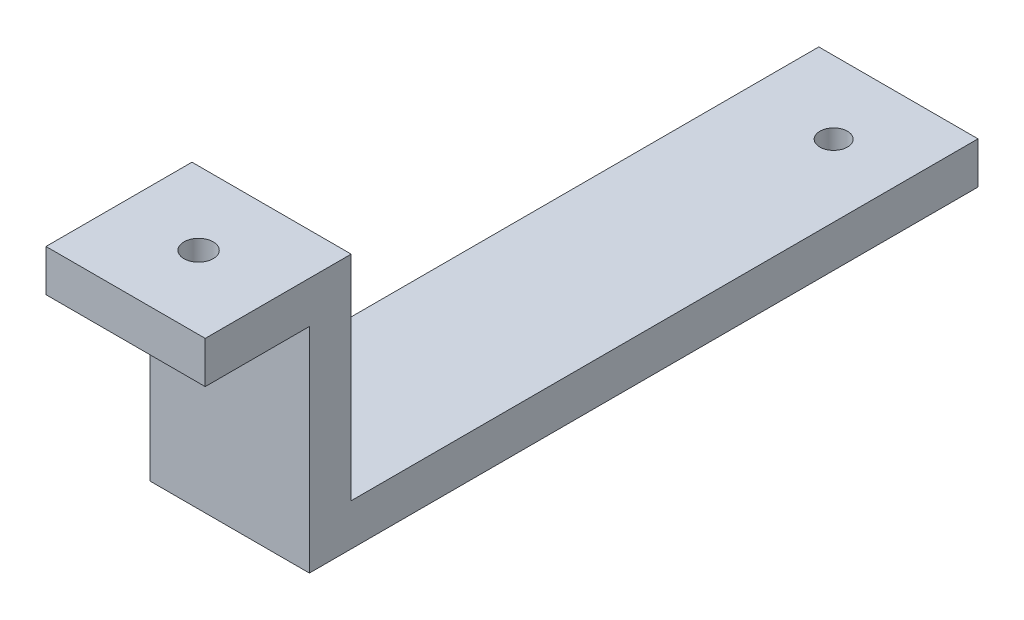
ISO-10303-21;
HEADER;
FILE_DESCRIPTION(('STEP AP214'),'2;1');
FILE_NAME('part.step','',(''),(''),'','','');
FILE_SCHEMA(('AUTOMOTIVE_DESIGN { 1 0 10303 214 1 1 1 1 }'));
ENDSEC;
DATA;
#1=APPLICATION_CONTEXT('core data for automotive mechanical design processes');
#2=APPLICATION_PROTOCOL_DEFINITION('international standard','automotive_design',2000,#1);
#3=PRODUCT_CONTEXT('',#1,'mechanical');
#4=PRODUCT('Part','Part','',(#3));
#5=PRODUCT_RELATED_PRODUCT_CATEGORY('part','',(#4));
#6=PRODUCT_DEFINITION_FORMATION('','',#4);
#7=PRODUCT_DEFINITION_CONTEXT('part definition',#1,'design');
#8=PRODUCT_DEFINITION('design','',#6,#7);
#9=PRODUCT_DEFINITION_SHAPE('','',#8);
#10=(LENGTH_UNIT() NAMED_UNIT(*) SI_UNIT(.MILLI.,.METRE.));
#11=(NAMED_UNIT(*) PLANE_ANGLE_UNIT() SI_UNIT($,.RADIAN.));
#12=(NAMED_UNIT(*) SI_UNIT($,.STERADIAN.) SOLID_ANGLE_UNIT());
#13=UNCERTAINTY_MEASURE_WITH_UNIT(LENGTH_MEASURE(1.E-05),#10,'distance_accuracy_value','');
#14=(GEOMETRIC_REPRESENTATION_CONTEXT(3) GLOBAL_UNCERTAINTY_ASSIGNED_CONTEXT((#13)) GLOBAL_UNIT_ASSIGNED_CONTEXT((#10,
#11,#12)) REPRESENTATION_CONTEXT('',''));
#15=CARTESIAN_POINT('',(0.,0.,0.));
#16=DIRECTION('',(0.,0.,1.));
#17=DIRECTION('',(1.,0.,0.));
#18=AXIS2_PLACEMENT_3D('',#15,#16,#17);
#19=CARTESIAN_POINT('',(38.1,-61.11,-34.93));
#20=DIRECTION('',(0.,1.,0.));
#21=DIRECTION('',(0.,0.,1.));
#22=AXIS2_PLACEMENT_3D('',#19,#20,#21);
#23=PLANE('',#22);
#24=CARTESIAN_POINT('',(20.8975904207719,-61.11,-167.593539999984));
#25=DIRECTION('',(0.,1.,0.));
#26=DIRECTION('',(0.,0.,1.));
#27=AXIS2_PLACEMENT_3D('',#24,#25,#26);
#28=CIRCLE('',#27,3.3);
#29=CARTESIAN_POINT('',(20.8975904207719,-61.11,-164.293539999984));
#30=VERTEX_POINT('',#29);
#31=EDGE_CURVE('E183',#30,#30,#28,.T.);
#32=ORIENTED_EDGE('',*,*,#31,.T.);
#33=EDGE_LOOP('',(#32));
#34=FACE_BOUND('',#33,.T.);
#35=DIRECTION('',(0.,0.,-1.));
#36=VECTOR('',#35,1.);
#37=CARTESIAN_POINT('',(0.,-61.11,-34.93));
#38=LINE('',#37,#36);
#39=CARTESIAN_POINT('',(0.,-61.11,-24.93));
#40=VERTEX_POINT('',#39);
#41=CARTESIAN_POINT('',(0.,-61.11,-184.93));
#42=VERTEX_POINT('',#41);
#43=EDGE_CURVE('E132',#40,#42,#38,.T.);
#44=ORIENTED_EDGE('',*,*,#43,.T.);
#45=DIRECTION('',(-1.,0.,0.));
#46=VECTOR('',#45,1.);
#47=CARTESIAN_POINT('',(38.1,-61.11,-184.93));
#48=LINE('',#47,#46);
#49=CARTESIAN_POINT('',(38.1,-61.11,-184.93));
#50=VERTEX_POINT('',#49);
#51=EDGE_CURVE('E11',#50,#42,#48,.T.);
#52=ORIENTED_EDGE('',*,*,#51,.F.);
#53=DIRECTION('',(0.,0.,-1.));
#54=VECTOR('',#53,1.);
#55=CARTESIAN_POINT('',(38.1,-61.11,-34.93));
#56=LINE('',#55,#54);
#57=CARTESIAN_POINT('',(38.1,-61.11,-24.93));
#58=VERTEX_POINT('',#57);
#59=EDGE_CURVE('E90',#58,#50,#56,.T.);
#60=ORIENTED_EDGE('',*,*,#59,.F.);
#61=DIRECTION('',(-1.,0.,0.));
#62=VECTOR('',#61,1.);
#63=CARTESIAN_POINT('',(38.1,-61.11,-24.93));
#64=LINE('',#63,#62);
#65=EDGE_CURVE('E131',#58,#40,#64,.T.);
#66=ORIENTED_EDGE('',*,*,#65,.T.);
#67=EDGE_LOOP('',(#44,#52,#60,#66));
#68=FACE_BOUND('',#67,.T.);
#69=ADVANCED_FACE('F34',(#34,#68),#23,.F.);
#70=CARTESIAN_POINT('',(38.1,-51.11,-184.93));
#71=DIRECTION('',(0.,0.,-1.));
#72=DIRECTION('',(0.,1.,0.));
#73=AXIS2_PLACEMENT_3D('',#70,#71,#72);
#74=PLANE('',#73);
#75=DIRECTION('',(0.,-1.,0.));
#76=VECTOR('',#75,1.);
#77=CARTESIAN_POINT('',(0.,-51.11,-184.93));
#78=LINE('',#77,#76);
#79=CARTESIAN_POINT('',(0.,-51.11,-184.93));
#80=VERTEX_POINT('',#79);
#81=EDGE_CURVE('E135',#80,#42,#78,.T.);
#82=ORIENTED_EDGE('',*,*,#81,.F.);
#83=DIRECTION('',(-1.,0.,0.));
#84=VECTOR('',#83,1.);
#85=CARTESIAN_POINT('',(38.1,-51.11,-184.93));
#86=LINE('',#85,#84);
#87=CARTESIAN_POINT('',(38.1,-51.11,-184.93));
#88=VERTEX_POINT('',#87);
#89=EDGE_CURVE('E43',#88,#80,#86,.T.);
#90=ORIENTED_EDGE('',*,*,#89,.F.);
#91=DIRECTION('',(0.,-1.,0.));
#92=VECTOR('',#91,1.);
#93=CARTESIAN_POINT('',(38.1,-51.11,-184.93));
#94=LINE('',#93,#92);
#95=EDGE_CURVE('E175',#88,#50,#94,.T.);
#96=ORIENTED_EDGE('',*,*,#95,.T.);
#97=ORIENTED_EDGE('',*,*,#51,.T.);
#98=EDGE_LOOP('',(#82,#90,#96,#97));
#99=FACE_BOUND('',#98,.T.);
#100=ADVANCED_FACE('F166',(#99),#74,.T.);
#101=CARTESIAN_POINT('',(38.1,-51.11,-34.93));
#102=DIRECTION('',(0.,1.,0.));
#103=DIRECTION('',(0.,0.,1.));
#104=AXIS2_PLACEMENT_3D('',#101,#102,#103);
#105=PLANE('',#104);
#106=CARTESIAN_POINT('',(20.8975904207719,-51.11,-167.593539999984));
#107=DIRECTION('',(0.,1.,0.));
#108=DIRECTION('',(0.,0.,1.));
#109=AXIS2_PLACEMENT_3D('',#106,#107,#108);
#110=CIRCLE('',#109,3.3);
#111=CARTESIAN_POINT('',(20.8975904207719,-51.11,-164.293539999984));
#112=VERTEX_POINT('',#111);
#113=EDGE_CURVE('E186',#112,#112,#110,.T.);
#114=ORIENTED_EDGE('',*,*,#113,.F.);
#115=EDGE_LOOP('',(#114));
#116=FACE_BOUND('',#115,.T.);
#117=DIRECTION('',(0.,0.,-1.));
#118=VECTOR('',#117,1.);
#119=CARTESIAN_POINT('',(0.,-51.11,-34.93));
#120=LINE('',#119,#118);
#121=CARTESIAN_POINT('',(0.,-51.11,-34.93));
#122=VERTEX_POINT('',#121);
#123=EDGE_CURVE('E138',#122,#80,#120,.T.);
#124=ORIENTED_EDGE('',*,*,#123,.F.);
#125=DIRECTION('',(-1.,0.,0.));
#126=VECTOR('',#125,1.);
#127=CARTESIAN_POINT('',(38.1,-51.11,-34.93));
#128=LINE('',#127,#126);
#129=CARTESIAN_POINT('',(38.1,-51.11,-34.93));
#130=VERTEX_POINT('',#129);
#131=EDGE_CURVE('E155',#130,#122,#128,.T.);
#132=ORIENTED_EDGE('',*,*,#131,.F.);
#133=DIRECTION('',(0.,0.,-1.));
#134=VECTOR('',#133,1.);
#135=CARTESIAN_POINT('',(38.1,-51.11,-34.93));
#136=LINE('',#135,#134);
#137=EDGE_CURVE('E163',#130,#88,#136,.T.);
#138=ORIENTED_EDGE('',*,*,#137,.T.);
#139=ORIENTED_EDGE('',*,*,#89,.T.);
#140=EDGE_LOOP('',(#124,#132,#138,#139));
#141=FACE_BOUND('',#140,.T.);
#142=ADVANCED_FACE('F161',(#116,#141),#105,.T.);
#143=CARTESIAN_POINT('',(38.1,0.,-34.93));
#144=DIRECTION('',(0.,0.,-1.));
#145=DIRECTION('',(-1.,0.,0.));
#146=AXIS2_PLACEMENT_3D('',#143,#144,#145);
#147=PLANE('',#146);
#148=DIRECTION('',(0.,-1.,0.));
#149=VECTOR('',#148,1.);
#150=CARTESIAN_POINT('',(0.,0.,-34.93));
#151=LINE('',#150,#149);
#152=CARTESIAN_POINT('',(0.,0.,-34.93));
#153=VERTEX_POINT('',#152);
#154=EDGE_CURVE('E141',#153,#122,#151,.T.);
#155=ORIENTED_EDGE('',*,*,#154,.F.);
#156=DIRECTION('',(-1.,0.,0.));
#157=VECTOR('',#156,1.);
#158=CARTESIAN_POINT('',(38.1,0.,-34.93));
#159=LINE('',#158,#157);
#160=CARTESIAN_POINT('',(38.1,0.,-34.93));
#161=VERTEX_POINT('',#160);
#162=EDGE_CURVE('E153',#161,#153,#159,.T.);
#163=ORIENTED_EDGE('',*,*,#162,.F.);
#164=DIRECTION('',(0.,-1.,0.));
#165=VECTOR('',#164,1.);
#166=CARTESIAN_POINT('',(38.1,0.,-34.93));
#167=LINE('',#166,#165);
#168=EDGE_CURVE('E126',#161,#130,#167,.T.);
#169=ORIENTED_EDGE('',*,*,#168,.T.);
#170=ORIENTED_EDGE('',*,*,#131,.T.);
#171=EDGE_LOOP('',(#155,#163,#169,#170));
#172=FACE_BOUND('',#171,.T.);
#173=ADVANCED_FACE('F173',(#172),#147,.T.);
#174=CARTESIAN_POINT('',(38.1,0.,0.));
#175=DIRECTION('',(0.,1.,0.));
#176=DIRECTION('',(0.,0.,1.));
#177=AXIS2_PLACEMENT_3D('',#174,#175,#176);
#178=PLANE('',#177);
#179=CARTESIAN_POINT('',(19.05,0.,-17.465));
#180=DIRECTION('',(0.,1.,0.));
#181=DIRECTION('',(0.,0.,1.));
#182=AXIS2_PLACEMENT_3D('',#179,#180,#181);
#183=CIRCLE('',#182,3.5);
#184=CARTESIAN_POINT('',(19.05,0.,-13.965));
#185=VERTEX_POINT('',#184);
#186=EDGE_CURVE('E180',#185,#185,#183,.T.);
#187=ORIENTED_EDGE('',*,*,#186,.F.);
#188=EDGE_LOOP('',(#187));
#189=FACE_BOUND('',#188,.T.);
#190=DIRECTION('',(0.,0.,-1.));
#191=VECTOR('',#190,1.);
#192=CARTESIAN_POINT('',(0.,0.,0.));
#193=LINE('',#192,#191);
#194=CARTESIAN_POINT('',(0.,0.,0.));
#195=VERTEX_POINT('',#194);
#196=EDGE_CURVE('E144',#195,#153,#193,.T.);
#197=ORIENTED_EDGE('',*,*,#196,.F.);
#198=DIRECTION('',(-1.,0.,0.));
#199=VECTOR('',#198,1.);
#200=CARTESIAN_POINT('',(38.1,0.,0.));
#201=LINE('',#200,#199);
#202=CARTESIAN_POINT('',(38.1,0.,0.));
#203=VERTEX_POINT('',#202);
#204=EDGE_CURVE('E114',#203,#195,#201,.T.);
#205=ORIENTED_EDGE('',*,*,#204,.F.);
#206=DIRECTION('',(0.,0.,-1.));
#207=VECTOR('',#206,1.);
#208=CARTESIAN_POINT('',(38.1,0.,0.));
#209=LINE('',#208,#207);
#210=EDGE_CURVE('E124',#203,#161,#209,.T.);
#211=ORIENTED_EDGE('',*,*,#210,.T.);
#212=ORIENTED_EDGE('',*,*,#162,.T.);
#213=EDGE_LOOP('',(#197,#205,#211,#212));
#214=FACE_BOUND('',#213,.T.);
#215=ADVANCED_FACE('F199',(#189,#214),#178,.T.);
#216=CARTESIAN_POINT('',(38.1,-10.,0.));
#217=DIRECTION('',(0.,0.,1.));
#218=DIRECTION('',(1.,0.,0.));
#219=AXIS2_PLACEMENT_3D('',#216,#217,#218);
#220=PLANE('',#219);
#221=DIRECTION('',(0.,1.,0.));
#222=VECTOR('',#221,1.);
#223=CARTESIAN_POINT('',(0.,-10.,0.));
#224=LINE('',#223,#222);
#225=CARTESIAN_POINT('',(0.,-10.,0.));
#226=VERTEX_POINT('',#225);
#227=EDGE_CURVE('E113',#226,#195,#224,.T.);
#228=ORIENTED_EDGE('',*,*,#227,.F.);
#229=DIRECTION('',(-1.,0.,0.));
#230=VECTOR('',#229,1.);
#231=CARTESIAN_POINT('',(38.1,-10.,0.));
#232=LINE('',#231,#230);
#233=CARTESIAN_POINT('',(38.1,-10.,0.));
#234=VERTEX_POINT('',#233);
#235=EDGE_CURVE('E107',#234,#226,#232,.T.);
#236=ORIENTED_EDGE('',*,*,#235,.F.);
#237=DIRECTION('',(0.,1.,0.));
#238=VECTOR('',#237,1.);
#239=CARTESIAN_POINT('',(38.1,-10.,0.));
#240=LINE('',#239,#238);
#241=EDGE_CURVE('E111',#234,#203,#240,.T.);
#242=ORIENTED_EDGE('',*,*,#241,.T.);
#243=ORIENTED_EDGE('',*,*,#204,.T.);
#244=EDGE_LOOP('',(#228,#236,#242,#243));
#245=FACE_BOUND('',#244,.T.);
#246=ADVANCED_FACE('F109',(#245),#220,.T.);
#247=CARTESIAN_POINT('',(38.1,-10.,0.));
#248=DIRECTION('',(0.,1.,0.));
#249=DIRECTION('',(0.,0.,1.));
#250=AXIS2_PLACEMENT_3D('',#247,#248,#249);
#251=PLANE('',#250);
#252=CARTESIAN_POINT('',(19.05,-10.,-17.465));
#253=DIRECTION('',(0.,1.,0.));
#254=DIRECTION('',(0.,0.,1.));
#255=AXIS2_PLACEMENT_3D('',#252,#253,#254);
#256=CIRCLE('',#255,3.5);
#257=CARTESIAN_POINT('',(19.05,-10.,-13.965));
#258=VERTEX_POINT('',#257);
#259=EDGE_CURVE('E37',#258,#258,#256,.T.);
#260=ORIENTED_EDGE('',*,*,#259,.T.);
#261=EDGE_LOOP('',(#260));
#262=FACE_BOUND('',#261,.T.);
#263=DIRECTION('',(0.,0.,-1.));
#264=VECTOR('',#263,1.);
#265=CARTESIAN_POINT('',(0.,-10.,0.));
#266=LINE('',#265,#264);
#267=CARTESIAN_POINT('',(0.,-10.,-24.93));
#268=VERTEX_POINT('',#267);
#269=EDGE_CURVE('E78',#226,#268,#266,.T.);
#270=ORIENTED_EDGE('',*,*,#269,.T.);
#271=DIRECTION('',(-1.,0.,0.));
#272=VECTOR('',#271,1.);
#273=CARTESIAN_POINT('',(38.1,-10.,-24.93));
#274=LINE('',#273,#272);
#275=CARTESIAN_POINT('',(38.1,-10.,-24.93));
#276=VERTEX_POINT('',#275);
#277=EDGE_CURVE('E115',#276,#268,#274,.T.);
#278=ORIENTED_EDGE('',*,*,#277,.F.);
#279=DIRECTION('',(0.,0.,-1.));
#280=VECTOR('',#279,1.);
#281=CARTESIAN_POINT('',(38.1,-10.,0.));
#282=LINE('',#281,#280);
#283=EDGE_CURVE('E117',#234,#276,#282,.T.);
#284=ORIENTED_EDGE('',*,*,#283,.F.);
#285=ORIENTED_EDGE('',*,*,#235,.T.);
#286=EDGE_LOOP('',(#270,#278,#284,#285));
#287=FACE_BOUND('',#286,.T.);
#288=ADVANCED_FACE('F118',(#262,#287),#251,.F.);
#289=CARTESIAN_POINT('',(38.1,0.,-24.93));
#290=DIRECTION('',(0.,0.,-1.));
#291=DIRECTION('',(-1.,0.,0.));
#292=AXIS2_PLACEMENT_3D('',#289,#290,#291);
#293=PLANE('',#292);
#294=DIRECTION('',(0.,1.,0.));
#295=VECTOR('',#294,1.);
#296=CARTESIAN_POINT('',(0.,0.,-24.93));
#297=LINE('',#296,#295);
#298=EDGE_CURVE('E84',#268,#40,#297,.F.);
#299=ORIENTED_EDGE('',*,*,#298,.T.);
#300=ORIENTED_EDGE('',*,*,#65,.F.);
#301=DIRECTION('',(0.,1.,0.));
#302=VECTOR('',#301,1.);
#303=CARTESIAN_POINT('',(38.1,0.,-24.93));
#304=LINE('',#303,#302);
#305=EDGE_CURVE('E51',#276,#58,#304,.F.);
#306=ORIENTED_EDGE('',*,*,#305,.F.);
#307=ORIENTED_EDGE('',*,*,#277,.T.);
#308=EDGE_LOOP('',(#299,#300,#306,#307));
#309=FACE_BOUND('',#308,.T.);
#310=ADVANCED_FACE('F207',(#309),#293,.F.);
#311=CARTESIAN_POINT('',(38.1,0.,0.));
#312=DIRECTION('',(-1.,0.,0.));
#313=DIRECTION('',(0.,0.,1.));
#314=AXIS2_PLACEMENT_3D('',#311,#312,#313);
#315=PLANE('',#314);
#316=ORIENTED_EDGE('',*,*,#59,.T.);
#317=ORIENTED_EDGE('',*,*,#95,.F.);
#318=ORIENTED_EDGE('',*,*,#137,.F.);
#319=ORIENTED_EDGE('',*,*,#168,.F.);
#320=ORIENTED_EDGE('',*,*,#210,.F.);
#321=ORIENTED_EDGE('',*,*,#241,.F.);
#322=ORIENTED_EDGE('',*,*,#283,.T.);
#323=ORIENTED_EDGE('',*,*,#305,.T.);
#324=EDGE_LOOP('',(#316,#317,#318,#319,#320,#321,#322,#323));
#325=FACE_BOUND('',#324,.T.);
#326=ADVANCED_FACE('F121',(#325),#315,.F.);
#327=CARTESIAN_POINT('',(0.,0.,0.));
#328=DIRECTION('',(-1.,0.,0.));
#329=DIRECTION('',(0.,0.,1.));
#330=AXIS2_PLACEMENT_3D('',#327,#328,#329);
#331=PLANE('',#330);
#332=ORIENTED_EDGE('',*,*,#43,.F.);
#333=ORIENTED_EDGE('',*,*,#298,.F.);
#334=ORIENTED_EDGE('',*,*,#269,.F.);
#335=ORIENTED_EDGE('',*,*,#227,.T.);
#336=ORIENTED_EDGE('',*,*,#196,.T.);
#337=ORIENTED_EDGE('',*,*,#154,.T.);
#338=ORIENTED_EDGE('',*,*,#123,.T.);
#339=ORIENTED_EDGE('',*,*,#81,.T.);
#340=EDGE_LOOP('',(#332,#333,#334,#335,#336,#337,#338,#339));
#341=FACE_BOUND('',#340,.T.);
#342=ADVANCED_FACE('F169',(#341),#331,.T.);
#343=CARTESIAN_POINT('',(19.05,-61.11,-17.465));
#344=DIRECTION('',(0.,1.,0.));
#345=DIRECTION('',(0.,0.,1.));
#346=AXIS2_PLACEMENT_3D('',#343,#344,#345);
#347=CYLINDRICAL_SURFACE('',#346,3.5);
#348=ORIENTED_EDGE('',*,*,#186,.T.);
#349=EDGE_LOOP('',(#348));
#350=FACE_BOUND('',#349,.T.);
#351=ORIENTED_EDGE('',*,*,#259,.F.);
#352=EDGE_LOOP('',(#351));
#353=FACE_BOUND('',#352,.T.);
#354=ADVANCED_FACE('F228',(#350,#353),#347,.F.);
#355=CARTESIAN_POINT('',(20.8975904207719,-111.11,-167.593539999984));
#356=DIRECTION('',(0.,1.,0.));
#357=DIRECTION('',(0.,0.,1.));
#358=AXIS2_PLACEMENT_3D('',#355,#356,#357);
#359=CYLINDRICAL_SURFACE('',#358,3.3);
#360=ORIENTED_EDGE('',*,*,#113,.T.);
#361=EDGE_LOOP('',(#360));
#362=FACE_BOUND('',#361,.T.);
#363=ORIENTED_EDGE('',*,*,#31,.F.);
#364=EDGE_LOOP('',(#363));
#365=FACE_BOUND('',#364,.T.);
#366=ADVANCED_FACE('F190',(#362,#365),#359,.F.);
#367=CLOSED_SHELL('',(#69,#100,#142,#173,#215,#246,#288,#310,#326,#342,#354,#366));
#368=MANIFOLD_SOLID_BREP('B2',#367);
#369=ADVANCED_BREP_SHAPE_REPRESENTATION('',(#18,#368),#14);
#370=SHAPE_DEFINITION_REPRESENTATION(#9,#369);
ENDSEC;
END-ISO-10303-21;
